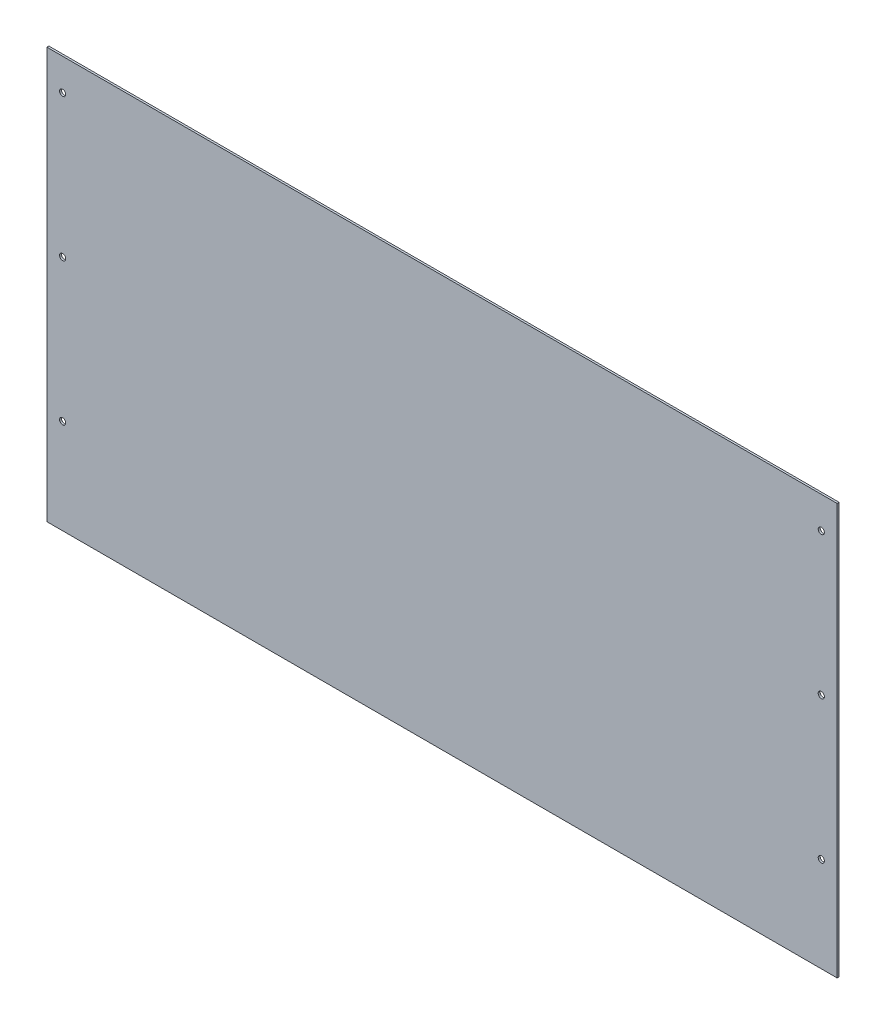
ISO-10303-21;
HEADER;
FILE_DESCRIPTION(('STEP AP214'),'2;1');
FILE_NAME('part.step','',(''),(''),'','','');
FILE_SCHEMA(('AUTOMOTIVE_DESIGN { 1 0 10303 214 1 1 1 1 }'));
ENDSEC;
DATA;
#1=APPLICATION_CONTEXT('core data for automotive mechanical design processes');
#2=APPLICATION_PROTOCOL_DEFINITION('international standard','automotive_design',2000,#1);
#3=PRODUCT_CONTEXT('',#1,'mechanical');
#4=PRODUCT('Part','Part','',(#3));
#5=PRODUCT_RELATED_PRODUCT_CATEGORY('part','',(#4));
#6=PRODUCT_DEFINITION_FORMATION('','',#4);
#7=PRODUCT_DEFINITION_CONTEXT('part definition',#1,'design');
#8=PRODUCT_DEFINITION('design','',#6,#7);
#9=PRODUCT_DEFINITION_SHAPE('','',#8);
#10=(LENGTH_UNIT() NAMED_UNIT(*) SI_UNIT(.MILLI.,.METRE.));
#11=(NAMED_UNIT(*) PLANE_ANGLE_UNIT() SI_UNIT($,.RADIAN.));
#12=(NAMED_UNIT(*) SI_UNIT($,.STERADIAN.) SOLID_ANGLE_UNIT());
#13=UNCERTAINTY_MEASURE_WITH_UNIT(LENGTH_MEASURE(1.E-05),#10,'distance_accuracy_value','');
#14=(GEOMETRIC_REPRESENTATION_CONTEXT(3) GLOBAL_UNCERTAINTY_ASSIGNED_CONTEXT((#13)) GLOBAL_UNIT_ASSIGNED_CONTEXT((#10,
#11,#12)) REPRESENTATION_CONTEXT('',''));
#15=CARTESIAN_POINT('',(0.,0.,0.));
#16=DIRECTION('',(0.,0.,1.));
#17=DIRECTION('',(1.,0.,0.));
#18=AXIS2_PLACEMENT_3D('',#15,#16,#17);
#19=CARTESIAN_POINT('',(-317.5,-165.1,0.79375));
#20=DIRECTION('',(0.,1.,0.));
#21=DIRECTION('',(0.,0.,1.));
#22=AXIS2_PLACEMENT_3D('',#19,#20,#21);
#23=PLANE('',#22);
#24=DIRECTION('',(1.,0.,0.));
#25=VECTOR('',#24,1.);
#26=CARTESIAN_POINT('',(-317.5,-165.1,-0.79375));
#27=LINE('',#26,#25);
#28=CARTESIAN_POINT('',(-317.5,-165.1,-0.79375));
#29=VERTEX_POINT('',#28);
#30=CARTESIAN_POINT('',(317.5,-165.1,-0.79375));
#31=VERTEX_POINT('',#30);
#32=EDGE_CURVE('E100',#29,#31,#27,.T.);
#33=ORIENTED_EDGE('',*,*,#32,.T.);
#34=DIRECTION('',(0.,0.,-1.));
#35=VECTOR('',#34,1.);
#36=CARTESIAN_POINT('',(317.5,-165.1,0.79375));
#37=LINE('',#36,#35);
#38=CARTESIAN_POINT('',(317.5,-165.1,0.79375));
#39=VERTEX_POINT('',#38);
#40=EDGE_CURVE('E11',#39,#31,#37,.T.);
#41=ORIENTED_EDGE('',*,*,#40,.F.);
#42=DIRECTION('',(1.,0.,0.));
#43=VECTOR('',#42,1.);
#44=CARTESIAN_POINT('',(-317.5,-165.1,0.79375));
#45=LINE('',#44,#43);
#46=CARTESIAN_POINT('',(-317.5,-165.1,0.79375));
#47=VERTEX_POINT('',#46);
#48=EDGE_CURVE('E88',#47,#39,#45,.T.);
#49=ORIENTED_EDGE('',*,*,#48,.F.);
#50=DIRECTION('',(0.,0.,-1.));
#51=VECTOR('',#50,1.);
#52=CARTESIAN_POINT('',(-317.5,-165.1,0.79375));
#53=LINE('',#52,#51);
#54=EDGE_CURVE('E96',#47,#29,#53,.T.);
#55=ORIENTED_EDGE('',*,*,#54,.T.);
#56=EDGE_LOOP('',(#33,#41,#49,#55));
#57=FACE_BOUND('',#56,.T.);
#58=ADVANCED_FACE('F37',(#57),#23,.F.);
#59=CARTESIAN_POINT('',(317.5,-165.1,0.79375));
#60=DIRECTION('',(-1.,0.,0.));
#61=DIRECTION('',(0.,0.,1.));
#62=AXIS2_PLACEMENT_3D('',#59,#60,#61);
#63=PLANE('',#62);
#64=DIRECTION('',(0.,1.,0.));
#65=VECTOR('',#64,1.);
#66=CARTESIAN_POINT('',(317.5,-165.1,-0.79375));
#67=LINE('',#66,#65);
#68=CARTESIAN_POINT('',(317.5,165.1,-0.79375));
#69=VERTEX_POINT('',#68);
#70=EDGE_CURVE('E92',#31,#69,#67,.T.);
#71=ORIENTED_EDGE('',*,*,#70,.T.);
#72=DIRECTION('',(0.,0.,-1.));
#73=VECTOR('',#72,1.);
#74=CARTESIAN_POINT('',(317.5,165.1,0.79375));
#75=LINE('',#74,#73);
#76=CARTESIAN_POINT('',(317.5,165.1,0.79375));
#77=VERTEX_POINT('',#76);
#78=EDGE_CURVE('E45',#77,#69,#75,.T.);
#79=ORIENTED_EDGE('',*,*,#78,.F.);
#80=DIRECTION('',(0.,1.,0.));
#81=VECTOR('',#80,1.);
#82=CARTESIAN_POINT('',(317.5,-165.1,0.79375));
#83=LINE('',#82,#81);
#84=EDGE_CURVE('E83',#39,#77,#83,.T.);
#85=ORIENTED_EDGE('',*,*,#84,.F.);
#86=ORIENTED_EDGE('',*,*,#40,.T.);
#87=EDGE_LOOP('',(#71,#79,#85,#86));
#88=FACE_BOUND('',#87,.T.);
#89=ADVANCED_FACE('F91',(#88),#63,.F.);
#90=CARTESIAN_POINT('',(-317.5,165.1,0.79375));
#91=DIRECTION('',(0.,-1.,0.));
#92=DIRECTION('',(0.,0.,-1.));
#93=AXIS2_PLACEMENT_3D('',#90,#91,#92);
#94=PLANE('',#93);
#95=DIRECTION('',(-1.,0.,0.));
#96=VECTOR('',#95,1.);
#97=CARTESIAN_POINT('',(-317.5,165.1,-0.79375));
#98=LINE('',#97,#96);
#99=CARTESIAN_POINT('',(-317.5,165.1,-0.79375));
#100=VERTEX_POINT('',#99);
#101=EDGE_CURVE('E70',#69,#100,#98,.T.);
#102=ORIENTED_EDGE('',*,*,#101,.T.);
#103=DIRECTION('',(0.,0.,-1.));
#104=VECTOR('',#103,1.);
#105=CARTESIAN_POINT('',(-317.5,165.1,0.79375));
#106=LINE('',#105,#104);
#107=CARTESIAN_POINT('',(-317.5,165.1,0.79375));
#108=VERTEX_POINT('',#107);
#109=EDGE_CURVE('E93',#108,#100,#106,.T.);
#110=ORIENTED_EDGE('',*,*,#109,.F.);
#111=DIRECTION('',(-1.,0.,0.));
#112=VECTOR('',#111,1.);
#113=CARTESIAN_POINT('',(-317.5,165.1,0.79375));
#114=LINE('',#113,#112);
#115=EDGE_CURVE('E86',#77,#108,#114,.T.);
#116=ORIENTED_EDGE('',*,*,#115,.F.);
#117=ORIENTED_EDGE('',*,*,#78,.T.);
#118=EDGE_LOOP('',(#102,#110,#116,#117));
#119=FACE_BOUND('',#118,.T.);
#120=ADVANCED_FACE('F94',(#119),#94,.F.);
#121=CARTESIAN_POINT('',(-317.5,-165.1,0.79375));
#122=DIRECTION('',(1.,0.,0.));
#123=DIRECTION('',(0.,0.,-1.));
#124=AXIS2_PLACEMENT_3D('',#121,#122,#123);
#125=PLANE('',#124);
#126=DIRECTION('',(0.,-1.,0.));
#127=VECTOR('',#126,1.);
#128=CARTESIAN_POINT('',(-317.5,-165.1,-0.79375));
#129=LINE('',#128,#127);
#130=EDGE_CURVE('E76',#100,#29,#129,.T.);
#131=ORIENTED_EDGE('',*,*,#130,.T.);
#132=ORIENTED_EDGE('',*,*,#54,.F.);
#133=DIRECTION('',(0.,-1.,0.));
#134=VECTOR('',#133,1.);
#135=CARTESIAN_POINT('',(-317.5,-165.1,0.79375));
#136=LINE('',#135,#134);
#137=EDGE_CURVE('E53',#108,#47,#136,.T.);
#138=ORIENTED_EDGE('',*,*,#137,.F.);
#139=ORIENTED_EDGE('',*,*,#109,.T.);
#140=EDGE_LOOP('',(#131,#132,#138,#139));
#141=FACE_BOUND('',#140,.T.);
#142=ADVANCED_FACE('F108',(#141),#125,.F.);
#143=CARTESIAN_POINT('',(0.,0.,0.79375));
#144=DIRECTION('',(0.,0.,1.));
#145=DIRECTION('',(1.,0.,0.));
#146=AXIS2_PLACEMENT_3D('',#143,#144,#145);
#147=PLANE('',#146);
#148=CARTESIAN_POINT('',(-304.8,139.7,0.793750000000001));
#149=DIRECTION('',(0.,0.,1.));
#150=DIRECTION('',(1.,0.,0.));
#151=AXIS2_PLACEMENT_3D('',#148,#149,#150);
#152=CIRCLE('',#151,2.48919999999997);
#153=CARTESIAN_POINT('',(-302.3108,139.7,0.793750000000001));
#154=VERTEX_POINT('',#153);
#155=EDGE_CURVE('E146',#154,#154,#152,.T.);
#156=ORIENTED_EDGE('',*,*,#155,.F.);
#157=EDGE_LOOP('',(#156));
#158=FACE_BOUND('',#157,.T.);
#159=CARTESIAN_POINT('',(-304.8,25.4,0.793750000000001));
#160=DIRECTION('',(0.,0.,1.));
#161=DIRECTION('',(1.,0.,0.));
#162=AXIS2_PLACEMENT_3D('',#159,#160,#161);
#163=CIRCLE('',#162,2.48919999999997);
#164=CARTESIAN_POINT('',(-302.3108,25.4,0.793750000000001));
#165=VERTEX_POINT('',#164);
#166=EDGE_CURVE('E140',#165,#165,#163,.T.);
#167=ORIENTED_EDGE('',*,*,#166,.F.);
#168=EDGE_LOOP('',(#167));
#169=FACE_BOUND('',#168,.T.);
#170=CARTESIAN_POINT('',(-304.8,-88.9,0.793750000000001));
#171=DIRECTION('',(0.,0.,1.));
#172=DIRECTION('',(1.,0.,0.));
#173=AXIS2_PLACEMENT_3D('',#170,#171,#172);
#174=CIRCLE('',#173,2.48919999999997);
#175=CARTESIAN_POINT('',(-302.3108,-88.9,0.793750000000001));
#176=VERTEX_POINT('',#175);
#177=EDGE_CURVE('E134',#176,#176,#174,.T.);
#178=ORIENTED_EDGE('',*,*,#177,.F.);
#179=EDGE_LOOP('',(#178));
#180=FACE_BOUND('',#179,.T.);
#181=CARTESIAN_POINT('',(304.735940925641,139.7,0.793750000000001));
#182=DIRECTION('',(0.,0.,1.));
#183=DIRECTION('',(1.,0.,0.));
#184=AXIS2_PLACEMENT_3D('',#181,#182,#183);
#185=CIRCLE('',#184,2.48919999999997);
#186=CARTESIAN_POINT('',(307.225140925641,139.7,0.793750000000001));
#187=VERTEX_POINT('',#186);
#188=EDGE_CURVE('E128',#187,#187,#185,.T.);
#189=ORIENTED_EDGE('',*,*,#188,.F.);
#190=EDGE_LOOP('',(#189));
#191=FACE_BOUND('',#190,.T.);
#192=CARTESIAN_POINT('',(304.735940925641,25.4,0.793750000000001));
#193=DIRECTION('',(0.,0.,1.));
#194=DIRECTION('',(1.,0.,0.));
#195=AXIS2_PLACEMENT_3D('',#192,#193,#194);
#196=CIRCLE('',#195,2.48919999999997);
#197=CARTESIAN_POINT('',(307.225140925641,25.4,0.793750000000001));
#198=VERTEX_POINT('',#197);
#199=EDGE_CURVE('E122',#198,#198,#196,.T.);
#200=ORIENTED_EDGE('',*,*,#199,.F.);
#201=EDGE_LOOP('',(#200));
#202=FACE_BOUND('',#201,.T.);
#203=CARTESIAN_POINT('',(304.735940925641,-88.9,0.793750000000001));
#204=DIRECTION('',(0.,0.,1.));
#205=DIRECTION('',(1.,0.,0.));
#206=AXIS2_PLACEMENT_3D('',#203,#204,#205);
#207=CIRCLE('',#206,2.48919999999997);
#208=CARTESIAN_POINT('',(307.225140925641,-88.9,0.793750000000001));
#209=VERTEX_POINT('',#208);
#210=EDGE_CURVE('E116',#209,#209,#207,.T.);
#211=ORIENTED_EDGE('',*,*,#210,.F.);
#212=EDGE_LOOP('',(#211));
#213=FACE_BOUND('',#212,.T.);
#214=ORIENTED_EDGE('',*,*,#48,.T.);
#215=ORIENTED_EDGE('',*,*,#84,.T.);
#216=ORIENTED_EDGE('',*,*,#115,.T.);
#217=ORIENTED_EDGE('',*,*,#137,.T.);
#218=EDGE_LOOP('',(#214,#215,#216,#217));
#219=FACE_BOUND('',#218,.T.);
#220=ADVANCED_FACE('F84',(#158,#169,#180,#191,#202,#213,#219),#147,.T.);
#221=CARTESIAN_POINT('',(0.,0.,-0.79375));
#222=DIRECTION('',(0.,0.,1.));
#223=DIRECTION('',(1.,0.,0.));
#224=AXIS2_PLACEMENT_3D('',#221,#222,#223);
#225=PLANE('',#224);
#226=CARTESIAN_POINT('',(-304.8,139.7,-0.793749999999999));
#227=DIRECTION('',(0.,0.,1.));
#228=DIRECTION('',(1.,0.,0.));
#229=AXIS2_PLACEMENT_3D('',#226,#227,#228);
#230=CIRCLE('',#229,2.48919999999997);
#231=CARTESIAN_POINT('',(-302.3108,139.7,-0.793749999999999));
#232=VERTEX_POINT('',#231);
#233=EDGE_CURVE('E143',#232,#232,#230,.T.);
#234=ORIENTED_EDGE('',*,*,#233,.T.);
#235=EDGE_LOOP('',(#234));
#236=FACE_BOUND('',#235,.T.);
#237=CARTESIAN_POINT('',(-304.8,25.4,-0.793749999999999));
#238=DIRECTION('',(0.,0.,1.));
#239=DIRECTION('',(1.,0.,0.));
#240=AXIS2_PLACEMENT_3D('',#237,#238,#239);
#241=CIRCLE('',#240,2.48919999999997);
#242=CARTESIAN_POINT('',(-302.3108,25.4,-0.793749999999999));
#243=VERTEX_POINT('',#242);
#244=EDGE_CURVE('E137',#243,#243,#241,.T.);
#245=ORIENTED_EDGE('',*,*,#244,.T.);
#246=EDGE_LOOP('',(#245));
#247=FACE_BOUND('',#246,.T.);
#248=CARTESIAN_POINT('',(-304.8,-88.9,-0.793749999999999));
#249=DIRECTION('',(0.,0.,1.));
#250=DIRECTION('',(1.,0.,0.));
#251=AXIS2_PLACEMENT_3D('',#248,#249,#250);
#252=CIRCLE('',#251,2.48919999999997);
#253=CARTESIAN_POINT('',(-302.3108,-88.9,-0.793749999999999));
#254=VERTEX_POINT('',#253);
#255=EDGE_CURVE('E131',#254,#254,#252,.T.);
#256=ORIENTED_EDGE('',*,*,#255,.T.);
#257=EDGE_LOOP('',(#256));
#258=FACE_BOUND('',#257,.T.);
#259=CARTESIAN_POINT('',(304.735940925641,139.7,-0.793749999999999));
#260=DIRECTION('',(0.,0.,1.));
#261=DIRECTION('',(1.,0.,0.));
#262=AXIS2_PLACEMENT_3D('',#259,#260,#261);
#263=CIRCLE('',#262,2.48919999999997);
#264=CARTESIAN_POINT('',(307.225140925641,139.7,-0.793749999999999));
#265=VERTEX_POINT('',#264);
#266=EDGE_CURVE('E125',#265,#265,#263,.T.);
#267=ORIENTED_EDGE('',*,*,#266,.T.);
#268=EDGE_LOOP('',(#267));
#269=FACE_BOUND('',#268,.T.);
#270=CARTESIAN_POINT('',(304.735940925641,25.4,-0.793749999999999));
#271=DIRECTION('',(0.,0.,1.));
#272=DIRECTION('',(1.,0.,0.));
#273=AXIS2_PLACEMENT_3D('',#270,#271,#272);
#274=CIRCLE('',#273,2.48919999999997);
#275=CARTESIAN_POINT('',(307.225140925641,25.4,-0.793749999999999));
#276=VERTEX_POINT('',#275);
#277=EDGE_CURVE('E119',#276,#276,#274,.T.);
#278=ORIENTED_EDGE('',*,*,#277,.T.);
#279=EDGE_LOOP('',(#278));
#280=FACE_BOUND('',#279,.T.);
#281=CARTESIAN_POINT('',(304.735940925641,-88.9,-0.793749999999999));
#282=DIRECTION('',(0.,0.,1.));
#283=DIRECTION('',(1.,0.,0.));
#284=AXIS2_PLACEMENT_3D('',#281,#282,#283);
#285=CIRCLE('',#284,2.48919999999997);
#286=CARTESIAN_POINT('',(307.225140925641,-88.9,-0.793749999999999));
#287=VERTEX_POINT('',#286);
#288=EDGE_CURVE('E103',#287,#287,#285,.T.);
#289=ORIENTED_EDGE('',*,*,#288,.T.);
#290=EDGE_LOOP('',(#289));
#291=FACE_BOUND('',#290,.T.);
#292=ORIENTED_EDGE('',*,*,#32,.F.);
#293=ORIENTED_EDGE('',*,*,#130,.F.);
#294=ORIENTED_EDGE('',*,*,#101,.F.);
#295=ORIENTED_EDGE('',*,*,#70,.F.);
#296=EDGE_LOOP('',(#292,#293,#294,#295));
#297=FACE_BOUND('',#296,.T.);
#298=ADVANCED_FACE('F111',(#236,#247,#258,#269,#280,#291,#297),#225,.F.);
#299=CARTESIAN_POINT('',(304.735940925641,-88.9,0.79375));
#300=DIRECTION('',(0.,0.,1.));
#301=DIRECTION('',(1.,0.,0.));
#302=AXIS2_PLACEMENT_3D('',#299,#300,#301);
#303=CYLINDRICAL_SURFACE('',#302,2.48919999999997);
#304=ORIENTED_EDGE('',*,*,#288,.F.);
#305=EDGE_LOOP('',(#304));
#306=FACE_BOUND('',#305,.T.);
#307=ORIENTED_EDGE('',*,*,#210,.T.);
#308=EDGE_LOOP('',(#307));
#309=FACE_BOUND('',#308,.T.);
#310=ADVANCED_FACE('F165',(#306,#309),#303,.F.);
#311=CARTESIAN_POINT('',(304.735940925641,25.4,0.79375));
#312=DIRECTION('',(0.,0.,1.));
#313=DIRECTION('',(1.,0.,0.));
#314=AXIS2_PLACEMENT_3D('',#311,#312,#313);
#315=CYLINDRICAL_SURFACE('',#314,2.48919999999997);
#316=ORIENTED_EDGE('',*,*,#277,.F.);
#317=EDGE_LOOP('',(#316));
#318=FACE_BOUND('',#317,.T.);
#319=ORIENTED_EDGE('',*,*,#199,.T.);
#320=EDGE_LOOP('',(#319));
#321=FACE_BOUND('',#320,.T.);
#322=ADVANCED_FACE('F167',(#318,#321),#315,.F.);
#323=CARTESIAN_POINT('',(304.735940925641,139.7,0.79375));
#324=DIRECTION('',(0.,0.,1.));
#325=DIRECTION('',(1.,0.,0.));
#326=AXIS2_PLACEMENT_3D('',#323,#324,#325);
#327=CYLINDRICAL_SURFACE('',#326,2.48919999999997);
#328=ORIENTED_EDGE('',*,*,#266,.F.);
#329=EDGE_LOOP('',(#328));
#330=FACE_BOUND('',#329,.T.);
#331=ORIENTED_EDGE('',*,*,#188,.T.);
#332=EDGE_LOOP('',(#331));
#333=FACE_BOUND('',#332,.T.);
#334=ADVANCED_FACE('F174',(#330,#333),#327,.F.);
#335=CARTESIAN_POINT('',(-304.8,-88.9,0.79375));
#336=DIRECTION('',(0.,0.,1.));
#337=DIRECTION('',(1.,0.,0.));
#338=AXIS2_PLACEMENT_3D('',#335,#336,#337);
#339=CYLINDRICAL_SURFACE('',#338,2.48919999999997);
#340=ORIENTED_EDGE('',*,*,#255,.F.);
#341=EDGE_LOOP('',(#340));
#342=FACE_BOUND('',#341,.T.);
#343=ORIENTED_EDGE('',*,*,#177,.T.);
#344=EDGE_LOOP('',(#343));
#345=FACE_BOUND('',#344,.T.);
#346=ADVANCED_FACE('F224',(#342,#345),#339,.F.);
#347=CARTESIAN_POINT('',(-304.8,25.4,0.79375));
#348=DIRECTION('',(0.,0.,1.));
#349=DIRECTION('',(1.,0.,0.));
#350=AXIS2_PLACEMENT_3D('',#347,#348,#349);
#351=CYLINDRICAL_SURFACE('',#350,2.48919999999997);
#352=ORIENTED_EDGE('',*,*,#244,.F.);
#353=EDGE_LOOP('',(#352));
#354=FACE_BOUND('',#353,.T.);
#355=ORIENTED_EDGE('',*,*,#166,.T.);
#356=EDGE_LOOP('',(#355));
#357=FACE_BOUND('',#356,.T.);
#358=ADVANCED_FACE('F235',(#354,#357),#351,.F.);
#359=CARTESIAN_POINT('',(-304.8,139.7,0.79375));
#360=DIRECTION('',(0.,0.,1.));
#361=DIRECTION('',(1.,0.,0.));
#362=AXIS2_PLACEMENT_3D('',#359,#360,#361);
#363=CYLINDRICAL_SURFACE('',#362,2.48919999999997);
#364=ORIENTED_EDGE('',*,*,#233,.F.);
#365=EDGE_LOOP('',(#364));
#366=FACE_BOUND('',#365,.T.);
#367=ORIENTED_EDGE('',*,*,#155,.T.);
#368=EDGE_LOOP('',(#367));
#369=FACE_BOUND('',#368,.T.);
#370=ADVANCED_FACE('F150',(#366,#369),#363,.F.);
#371=CLOSED_SHELL('',(#58,#89,#120,#142,#220,#298,#310,#322,#334,#346,#358,#370));
#372=MANIFOLD_SOLID_BREP('B2',#371);
#373=ADVANCED_BREP_SHAPE_REPRESENTATION('',(#18,#372),#14);
#374=SHAPE_DEFINITION_REPRESENTATION(#9,#373);
ENDSEC;
END-ISO-10303-21;
